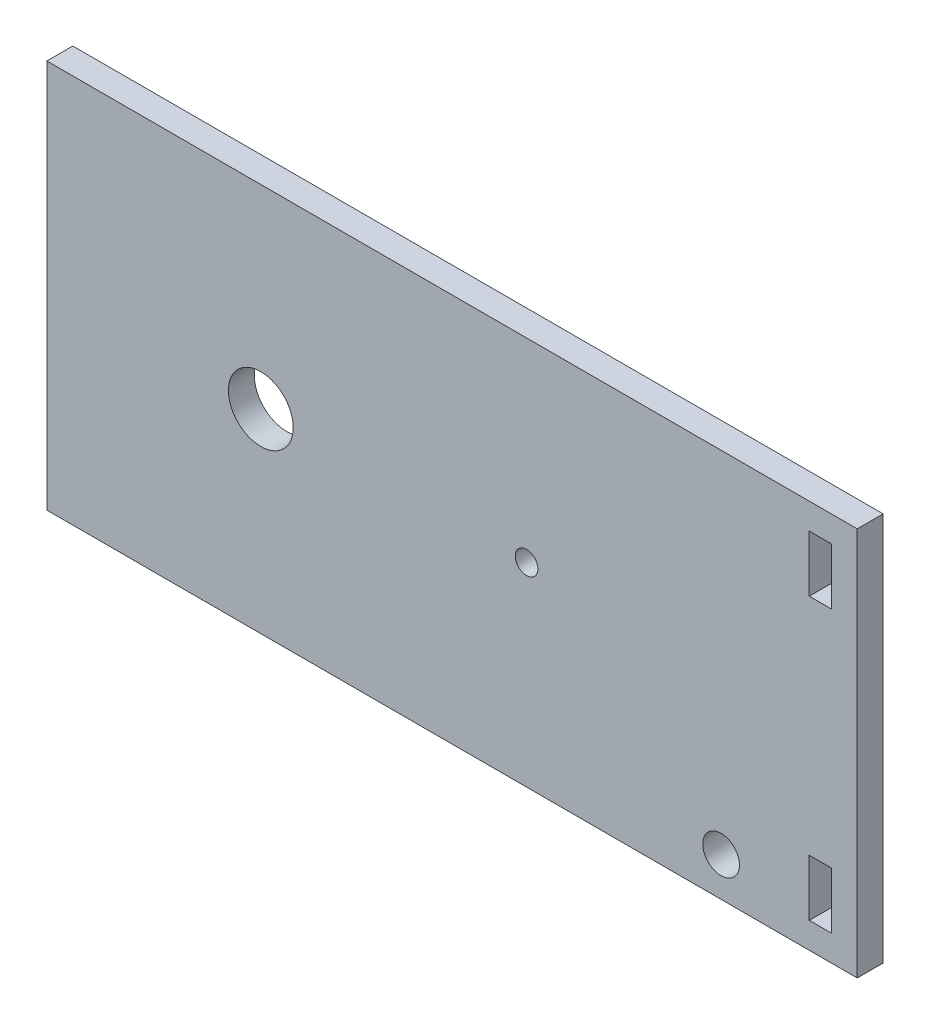
ISO-10303-21;
HEADER;
FILE_DESCRIPTION(('STEP AP214'),'2;1');
FILE_NAME('part.step','',(''),(''),'','','');
FILE_SCHEMA(('AUTOMOTIVE_DESIGN { 1 0 10303 214 1 1 1 1 }'));
ENDSEC;
DATA;
#1=APPLICATION_CONTEXT('core data for automotive mechanical design processes');
#2=APPLICATION_PROTOCOL_DEFINITION('international standard','automotive_design',2000,#1);
#3=PRODUCT_CONTEXT('',#1,'mechanical');
#4=PRODUCT('Part','Part','',(#3));
#5=PRODUCT_RELATED_PRODUCT_CATEGORY('part','',(#4));
#6=PRODUCT_DEFINITION_FORMATION('','',#4);
#7=PRODUCT_DEFINITION_CONTEXT('part definition',#1,'design');
#8=PRODUCT_DEFINITION('design','',#6,#7);
#9=PRODUCT_DEFINITION_SHAPE('','',#8);
#10=(LENGTH_UNIT() NAMED_UNIT(*) SI_UNIT(.MILLI.,.METRE.));
#11=(NAMED_UNIT(*) PLANE_ANGLE_UNIT() SI_UNIT($,.RADIAN.));
#12=(NAMED_UNIT(*) SI_UNIT($,.STERADIAN.) SOLID_ANGLE_UNIT());
#13=UNCERTAINTY_MEASURE_WITH_UNIT(LENGTH_MEASURE(1.E-05),#10,'distance_accuracy_value','');
#14=(GEOMETRIC_REPRESENTATION_CONTEXT(3) GLOBAL_UNCERTAINTY_ASSIGNED_CONTEXT((#13)) GLOBAL_UNIT_ASSIGNED_CONTEXT((#10,
#11,#12)) REPRESENTATION_CONTEXT('',''));
#15=CARTESIAN_POINT('',(0.,0.,0.));
#16=DIRECTION('',(0.,0.,1.));
#17=DIRECTION('',(1.,0.,0.));
#18=AXIS2_PLACEMENT_3D('',#15,#16,#17);
#19=CARTESIAN_POINT('',(0.,0.,4.));
#20=DIRECTION('',(0.,0.,1.));
#21=DIRECTION('',(1.,0.,0.));
#22=AXIS2_PLACEMENT_3D('',#19,#20,#21);
#23=PLANE('',#22);
#24=DIRECTION('',(-1.,0.,0.));
#25=VECTOR('',#24,1.);
#26=CARTESIAN_POINT('',(40.,26.,4.));
#27=LINE('',#26,#25);
#28=CARTESIAN_POINT('',(40.,26.,4.));
#29=VERTEX_POINT('',#28);
#30=CARTESIAN_POINT('',(36.6,26.,4.));
#31=VERTEX_POINT('',#30);
#32=EDGE_CURVE('E133',#29,#31,#27,.T.);
#33=ORIENTED_EDGE('',*,*,#32,.F.);
#34=DIRECTION('',(0.,1.,0.));
#35=VECTOR('',#34,1.);
#36=CARTESIAN_POINT('',(40.,26.,4.));
#37=LINE('',#36,#35);
#38=CARTESIAN_POINT('',(40.,17.3,4.));
#39=VERTEX_POINT('',#38);
#40=EDGE_CURVE('E124',#39,#29,#37,.T.);
#41=ORIENTED_EDGE('',*,*,#40,.F.);
#42=DIRECTION('',(1.,0.,0.));
#43=VECTOR('',#42,1.);
#44=CARTESIAN_POINT('',(40.,17.3,4.));
#45=LINE('',#44,#43);
#46=CARTESIAN_POINT('',(36.6,17.3,4.));
#47=VERTEX_POINT('',#46);
#48=EDGE_CURVE('E148',#47,#39,#45,.T.);
#49=ORIENTED_EDGE('',*,*,#48,.F.);
#50=DIRECTION('',(0.,-1.,0.));
#51=VECTOR('',#50,1.);
#52=CARTESIAN_POINT('',(36.6,26.,4.));
#53=LINE('',#52,#51);
#54=EDGE_CURVE('E146',#31,#47,#53,.T.);
#55=ORIENTED_EDGE('',*,*,#54,.F.);
#56=EDGE_LOOP('',(#33,#41,#49,#55));
#57=FACE_BOUND('',#56,.T.);
#58=DIRECTION('',(-1.,0.,0.));
#59=VECTOR('',#58,1.);
#60=CARTESIAN_POINT('',(40.,-17.3,4.));
#61=LINE('',#60,#59);
#62=CARTESIAN_POINT('',(40.,-17.3,4.));
#63=VERTEX_POINT('',#62);
#64=CARTESIAN_POINT('',(36.6,-17.3,4.));
#65=VERTEX_POINT('',#64);
#66=EDGE_CURVE('E158',#63,#65,#61,.T.);
#67=ORIENTED_EDGE('',*,*,#66,.F.);
#68=DIRECTION('',(0.,1.,0.));
#69=VECTOR('',#68,1.);
#70=CARTESIAN_POINT('',(40.,-17.3,4.));
#71=LINE('',#70,#69);
#72=CARTESIAN_POINT('',(40.,-26.,4.));
#73=VERTEX_POINT('',#72);
#74=EDGE_CURVE('E156',#73,#63,#71,.T.);
#75=ORIENTED_EDGE('',*,*,#74,.F.);
#76=DIRECTION('',(1.,0.,0.));
#77=VECTOR('',#76,1.);
#78=CARTESIAN_POINT('',(40.,-26.,4.));
#79=LINE('',#78,#77);
#80=CARTESIAN_POINT('',(36.6,-26.,4.));
#81=VERTEX_POINT('',#80);
#82=EDGE_CURVE('E162',#81,#73,#79,.T.);
#83=ORIENTED_EDGE('',*,*,#82,.F.);
#84=DIRECTION('',(0.,-1.,0.));
#85=VECTOR('',#84,1.);
#86=CARTESIAN_POINT('',(36.6,-17.3,4.));
#87=LINE('',#86,#85);
#88=EDGE_CURVE('E160',#65,#81,#87,.T.);
#89=ORIENTED_EDGE('',*,*,#88,.F.);
#90=EDGE_LOOP('',(#67,#75,#83,#89));
#91=FACE_BOUND('',#90,.T.);
#92=CARTESIAN_POINT('',(-48.,0.,4.));
#93=DIRECTION('',(0.,0.,1.));
#94=DIRECTION('',(1.,0.,0.));
#95=AXIS2_PLACEMENT_3D('',#92,#93,#94);
#96=CIRCLE('',#95,5.);
#97=CARTESIAN_POINT('',(-43.,0.,4.));
#98=VERTEX_POINT('',#97);
#99=EDGE_CURVE('E185',#98,#98,#96,.T.);
#100=ORIENTED_EDGE('',*,*,#99,.F.);
#101=EDGE_LOOP('',(#100));
#102=FACE_BOUND('',#101,.T.);
#103=DIRECTION('',(1.,0.,0.));
#104=VECTOR('',#103,1.);
#105=CARTESIAN_POINT('',(-81.,-30.,4.));
#106=LINE('',#105,#104);
#107=CARTESIAN_POINT('',(-81.,-30.,4.));
#108=VERTEX_POINT('',#107);
#109=CARTESIAN_POINT('',(44.,-30.,4.));
#110=VERTEX_POINT('',#109);
#111=EDGE_CURVE('E202',#108,#110,#106,.T.);
#112=ORIENTED_EDGE('',*,*,#111,.T.);
#113=DIRECTION('',(0.,1.,0.));
#114=VECTOR('',#113,1.);
#115=CARTESIAN_POINT('',(44.,-30.,4.));
#116=LINE('',#115,#114);
#117=CARTESIAN_POINT('',(44.,30.,4.));
#118=VERTEX_POINT('',#117);
#119=EDGE_CURVE('E172',#110,#118,#116,.T.);
#120=ORIENTED_EDGE('',*,*,#119,.T.);
#121=DIRECTION('',(-1.,0.,0.));
#122=VECTOR('',#121,1.);
#123=CARTESIAN_POINT('',(-81.,30.,4.));
#124=LINE('',#123,#122);
#125=CARTESIAN_POINT('',(-81.,30.,4.));
#126=VERTEX_POINT('',#125);
#127=EDGE_CURVE('E197',#118,#126,#124,.T.);
#128=ORIENTED_EDGE('',*,*,#127,.T.);
#129=DIRECTION('',(0.,-1.,0.));
#130=VECTOR('',#129,1.);
#131=CARTESIAN_POINT('',(-81.,-30.,4.));
#132=LINE('',#131,#130);
#133=EDGE_CURVE('E199',#126,#108,#132,.T.);
#134=ORIENTED_EDGE('',*,*,#133,.T.);
#135=EDGE_LOOP('',(#112,#120,#128,#134));
#136=FACE_BOUND('',#135,.T.);
#137=CARTESIAN_POINT('',(23.,-24.,4.));
#138=DIRECTION('',(0.,0.,1.));
#139=DIRECTION('',(1.,0.,0.));
#140=AXIS2_PLACEMENT_3D('',#137,#138,#139);
#141=CIRCLE('',#140,2.83);
#142=CARTESIAN_POINT('',(25.83,-24.,4.));
#143=VERTEX_POINT('',#142);
#144=EDGE_CURVE('E191',#143,#143,#141,.T.);
#145=ORIENTED_EDGE('',*,*,#144,.F.);
#146=EDGE_LOOP('',(#145));
#147=FACE_BOUND('',#146,.T.);
#148=CARTESIAN_POINT('',(-6.99999999999999,0.,4.));
#149=DIRECTION('',(0.,0.,1.));
#150=DIRECTION('',(1.,0.,0.));
#151=AXIS2_PLACEMENT_3D('',#148,#149,#150);
#152=CIRCLE('',#151,1.75);
#153=CARTESIAN_POINT('',(-5.24999999999999,0.,4.));
#154=VERTEX_POINT('',#153);
#155=EDGE_CURVE('E141',#154,#154,#152,.T.);
#156=ORIENTED_EDGE('',*,*,#155,.F.);
#157=EDGE_LOOP('',(#156));
#158=FACE_BOUND('',#157,.T.);
#159=ADVANCED_FACE('F33',(#57,#91,#102,#136,#147,#158),#23,.T.);
#160=CARTESIAN_POINT('',(0.,0.,0.));
#161=DIRECTION('',(0.,0.,1.));
#162=DIRECTION('',(1.,0.,0.));
#163=AXIS2_PLACEMENT_3D('',#160,#161,#162);
#164=PLANE('',#163);
#165=DIRECTION('',(0.,-1.,0.));
#166=VECTOR('',#165,1.);
#167=CARTESIAN_POINT('',(40.,0.,0.));
#168=LINE('',#167,#166);
#169=CARTESIAN_POINT('',(40.,-17.3,0.));
#170=VERTEX_POINT('',#169);
#171=CARTESIAN_POINT('',(40.,-26.,0.));
#172=VERTEX_POINT('',#171);
#173=EDGE_CURVE('E220',#170,#172,#168,.T.);
#174=ORIENTED_EDGE('',*,*,#173,.F.);
#175=DIRECTION('',(1.,0.,0.));
#176=VECTOR('',#175,1.);
#177=CARTESIAN_POINT('',(0.,-17.3,0.));
#178=LINE('',#177,#176);
#179=CARTESIAN_POINT('',(36.6,-17.3,0.));
#180=VERTEX_POINT('',#179);
#181=EDGE_CURVE('E218',#180,#170,#178,.T.);
#182=ORIENTED_EDGE('',*,*,#181,.F.);
#183=DIRECTION('',(0.,1.,0.));
#184=VECTOR('',#183,1.);
#185=CARTESIAN_POINT('',(36.6,0.,0.));
#186=LINE('',#185,#184);
#187=CARTESIAN_POINT('',(36.6,-26.,0.));
#188=VERTEX_POINT('',#187);
#189=EDGE_CURVE('E216',#188,#180,#186,.T.);
#190=ORIENTED_EDGE('',*,*,#189,.F.);
#191=DIRECTION('',(-1.,0.,0.));
#192=VECTOR('',#191,1.);
#193=CARTESIAN_POINT('',(0.,-26.,0.));
#194=LINE('',#193,#192);
#195=EDGE_CURVE('E214',#172,#188,#194,.T.);
#196=ORIENTED_EDGE('',*,*,#195,.F.);
#197=EDGE_LOOP('',(#174,#182,#190,#196));
#198=FACE_BOUND('',#197,.T.);
#199=DIRECTION('',(-1.,0.,0.));
#200=VECTOR('',#199,1.);
#201=CARTESIAN_POINT('',(-81.,30.,0.));
#202=LINE('',#201,#200);
#203=CARTESIAN_POINT('',(44.,30.,0.));
#204=VERTEX_POINT('',#203);
#205=CARTESIAN_POINT('',(-81.,30.,0.));
#206=VERTEX_POINT('',#205);
#207=EDGE_CURVE('E194',#204,#206,#202,.T.);
#208=ORIENTED_EDGE('',*,*,#207,.F.);
#209=DIRECTION('',(0.,1.,0.));
#210=VECTOR('',#209,1.);
#211=CARTESIAN_POINT('',(44.,-30.,0.));
#212=LINE('',#211,#210);
#213=CARTESIAN_POINT('',(44.,-30.,0.));
#214=VERTEX_POINT('',#213);
#215=EDGE_CURVE('E176',#214,#204,#212,.T.);
#216=ORIENTED_EDGE('',*,*,#215,.F.);
#217=DIRECTION('',(1.,0.,0.));
#218=VECTOR('',#217,1.);
#219=CARTESIAN_POINT('',(-81.,-30.,0.));
#220=LINE('',#219,#218);
#221=CARTESIAN_POINT('',(-81.,-30.,0.));
#222=VERTEX_POINT('',#221);
#223=EDGE_CURVE('E200',#222,#214,#220,.T.);
#224=ORIENTED_EDGE('',*,*,#223,.F.);
#225=DIRECTION('',(0.,-1.,0.));
#226=VECTOR('',#225,1.);
#227=CARTESIAN_POINT('',(-81.,-30.,0.));
#228=LINE('',#227,#226);
#229=EDGE_CURVE('E206',#206,#222,#228,.T.);
#230=ORIENTED_EDGE('',*,*,#229,.F.);
#231=EDGE_LOOP('',(#208,#216,#224,#230));
#232=FACE_BOUND('',#231,.T.);
#233=CARTESIAN_POINT('',(23.,-24.,0.));
#234=DIRECTION('',(0.,0.,1.));
#235=DIRECTION('',(1.,0.,0.));
#236=AXIS2_PLACEMENT_3D('',#233,#234,#235);
#237=CIRCLE('',#236,2.83);
#238=CARTESIAN_POINT('',(25.83,-24.,0.));
#239=VERTEX_POINT('',#238);
#240=EDGE_CURVE('E188',#239,#239,#237,.T.);
#241=ORIENTED_EDGE('',*,*,#240,.T.);
#242=EDGE_LOOP('',(#241));
#243=FACE_BOUND('',#242,.T.);
#244=CARTESIAN_POINT('',(-48.,0.,0.));
#245=DIRECTION('',(0.,0.,1.));
#246=DIRECTION('',(1.,0.,0.));
#247=AXIS2_PLACEMENT_3D('',#244,#245,#246);
#248=CIRCLE('',#247,5.);
#249=CARTESIAN_POINT('',(-43.,0.,0.));
#250=VERTEX_POINT('',#249);
#251=EDGE_CURVE('E184',#250,#250,#248,.T.);
#252=ORIENTED_EDGE('',*,*,#251,.T.);
#253=EDGE_LOOP('',(#252));
#254=FACE_BOUND('',#253,.T.);
#255=DIRECTION('',(0.,-1.,0.));
#256=VECTOR('',#255,1.);
#257=CARTESIAN_POINT('',(40.,0.,0.));
#258=LINE('',#257,#256);
#259=CARTESIAN_POINT('',(40.,26.,0.));
#260=VERTEX_POINT('',#259);
#261=CARTESIAN_POINT('',(40.,17.3,0.));
#262=VERTEX_POINT('',#261);
#263=EDGE_CURVE('E11',#260,#262,#258,.T.);
#264=ORIENTED_EDGE('',*,*,#263,.F.);
#265=DIRECTION('',(1.,0.,0.));
#266=VECTOR('',#265,1.);
#267=CARTESIAN_POINT('',(0.,26.,0.));
#268=LINE('',#267,#266);
#269=CARTESIAN_POINT('',(36.6,26.,0.));
#270=VERTEX_POINT('',#269);
#271=EDGE_CURVE('E42',#270,#260,#268,.T.);
#272=ORIENTED_EDGE('',*,*,#271,.F.);
#273=DIRECTION('',(0.,1.,0.));
#274=VECTOR('',#273,1.);
#275=CARTESIAN_POINT('',(36.6,0.,0.));
#276=LINE('',#275,#274);
#277=CARTESIAN_POINT('',(36.6,17.3,0.));
#278=VERTEX_POINT('',#277);
#279=EDGE_CURVE('E225',#278,#270,#276,.T.);
#280=ORIENTED_EDGE('',*,*,#279,.F.);
#281=DIRECTION('',(-1.,0.,0.));
#282=VECTOR('',#281,1.);
#283=CARTESIAN_POINT('',(0.,17.3,0.));
#284=LINE('',#283,#282);
#285=EDGE_CURVE('E223',#262,#278,#284,.T.);
#286=ORIENTED_EDGE('',*,*,#285,.F.);
#287=EDGE_LOOP('',(#264,#272,#280,#286));
#288=FACE_BOUND('',#287,.T.);
#289=CARTESIAN_POINT('',(-6.99999999999999,0.,0.));
#290=DIRECTION('',(0.,0.,1.));
#291=DIRECTION('',(1.,0.,0.));
#292=AXIS2_PLACEMENT_3D('',#289,#290,#291);
#293=CIRCLE('',#292,1.75);
#294=CARTESIAN_POINT('',(-5.24999999999999,0.,0.));
#295=VERTEX_POINT('',#294);
#296=EDGE_CURVE('E37',#295,#295,#293,.F.);
#297=ORIENTED_EDGE('',*,*,#296,.F.);
#298=EDGE_LOOP('',(#297));
#299=FACE_BOUND('',#298,.T.);
#300=ADVANCED_FACE('F232',(#198,#232,#243,#254,#288,#299),#164,.F.);
#301=CARTESIAN_POINT('',(-81.,30.,4.));
#302=DIRECTION('',(0.,-1.,0.));
#303=DIRECTION('',(0.,0.,-1.));
#304=AXIS2_PLACEMENT_3D('',#301,#302,#303);
#305=PLANE('',#304);
#306=ORIENTED_EDGE('',*,*,#207,.T.);
#307=DIRECTION('',(0.,0.,-1.));
#308=VECTOR('',#307,1.);
#309=CARTESIAN_POINT('',(-81.,30.,4.));
#310=LINE('',#309,#308);
#311=EDGE_CURVE('E211',#126,#206,#310,.T.);
#312=ORIENTED_EDGE('',*,*,#311,.F.);
#313=ORIENTED_EDGE('',*,*,#127,.F.);
#314=DIRECTION('',(0.,0.,-1.));
#315=VECTOR('',#314,1.);
#316=CARTESIAN_POINT('',(44.,30.,4.));
#317=LINE('',#316,#315);
#318=EDGE_CURVE('E175',#118,#204,#317,.T.);
#319=ORIENTED_EDGE('',*,*,#318,.T.);
#320=EDGE_LOOP('',(#306,#312,#313,#319));
#321=FACE_BOUND('',#320,.T.);
#322=ADVANCED_FACE('F35',(#321),#305,.F.);
#323=CARTESIAN_POINT('',(-81.,-30.,4.));
#324=DIRECTION('',(1.,0.,0.));
#325=DIRECTION('',(0.,0.,-1.));
#326=AXIS2_PLACEMENT_3D('',#323,#324,#325);
#327=PLANE('',#326);
#328=ORIENTED_EDGE('',*,*,#229,.T.);
#329=DIRECTION('',(0.,0.,-1.));
#330=VECTOR('',#329,1.);
#331=CARTESIAN_POINT('',(-81.,-30.,4.));
#332=LINE('',#331,#330);
#333=EDGE_CURVE('E204',#108,#222,#332,.T.);
#334=ORIENTED_EDGE('',*,*,#333,.F.);
#335=ORIENTED_EDGE('',*,*,#133,.F.);
#336=ORIENTED_EDGE('',*,*,#311,.T.);
#337=EDGE_LOOP('',(#328,#334,#335,#336));
#338=FACE_BOUND('',#337,.T.);
#339=ADVANCED_FACE('F258',(#338),#327,.F.);
#340=CARTESIAN_POINT('',(-81.,-30.,4.));
#341=DIRECTION('',(0.,1.,0.));
#342=DIRECTION('',(0.,0.,1.));
#343=AXIS2_PLACEMENT_3D('',#340,#341,#342);
#344=PLANE('',#343);
#345=ORIENTED_EDGE('',*,*,#223,.T.);
#346=DIRECTION('',(0.,0.,-1.));
#347=VECTOR('',#346,1.);
#348=CARTESIAN_POINT('',(44.,-30.,4.));
#349=LINE('',#348,#347);
#350=EDGE_CURVE('E181',#110,#214,#349,.T.);
#351=ORIENTED_EDGE('',*,*,#350,.F.);
#352=ORIENTED_EDGE('',*,*,#111,.F.);
#353=ORIENTED_EDGE('',*,*,#333,.T.);
#354=EDGE_LOOP('',(#345,#351,#352,#353));
#355=FACE_BOUND('',#354,.T.);
#356=ADVANCED_FACE('F256',(#355),#344,.F.);
#357=CARTESIAN_POINT('',(23.,-24.,4.));
#358=DIRECTION('',(0.,0.,-1.));
#359=DIRECTION('',(-1.,0.,0.));
#360=AXIS2_PLACEMENT_3D('',#357,#358,#359);
#361=CYLINDRICAL_SURFACE('',#360,2.83);
#362=ORIENTED_EDGE('',*,*,#144,.T.);
#363=EDGE_LOOP('',(#362));
#364=FACE_BOUND('',#363,.T.);
#365=ORIENTED_EDGE('',*,*,#240,.F.);
#366=EDGE_LOOP('',(#365));
#367=FACE_BOUND('',#366,.T.);
#368=ADVANCED_FACE('F253',(#364,#367),#361,.F.);
#369=CARTESIAN_POINT('',(-48.,0.,4.));
#370=DIRECTION('',(0.,0.,-1.));
#371=DIRECTION('',(-1.,0.,0.));
#372=AXIS2_PLACEMENT_3D('',#369,#370,#371);
#373=CYLINDRICAL_SURFACE('',#372,5.);
#374=ORIENTED_EDGE('',*,*,#99,.T.);
#375=EDGE_LOOP('',(#374));
#376=FACE_BOUND('',#375,.T.);
#377=ORIENTED_EDGE('',*,*,#251,.F.);
#378=EDGE_LOOP('',(#377));
#379=FACE_BOUND('',#378,.T.);
#380=ADVANCED_FACE('F292',(#376,#379),#373,.F.);
#381=CARTESIAN_POINT('',(44.,-30.,4.));
#382=DIRECTION('',(-1.,0.,0.));
#383=DIRECTION('',(0.,0.,1.));
#384=AXIS2_PLACEMENT_3D('',#381,#382,#383);
#385=PLANE('',#384);
#386=ORIENTED_EDGE('',*,*,#215,.T.);
#387=ORIENTED_EDGE('',*,*,#318,.F.);
#388=ORIENTED_EDGE('',*,*,#119,.F.);
#389=ORIENTED_EDGE('',*,*,#350,.T.);
#390=EDGE_LOOP('',(#386,#387,#388,#389));
#391=FACE_BOUND('',#390,.T.);
#392=ADVANCED_FACE('F278',(#391),#385,.F.);
#393=CARTESIAN_POINT('',(40.,-17.3,4.));
#394=DIRECTION('',(-1.,0.,0.));
#395=DIRECTION('',(0.,0.,1.));
#396=AXIS2_PLACEMENT_3D('',#393,#394,#395);
#397=PLANE('',#396);
#398=ORIENTED_EDGE('',*,*,#173,.T.);
#399=DIRECTION('',(0.,0.,-1.));
#400=VECTOR('',#399,1.);
#401=CARTESIAN_POINT('',(40.,-26.,4.));
#402=LINE('',#401,#400);
#403=EDGE_CURVE('E164',#73,#172,#402,.T.);
#404=ORIENTED_EDGE('',*,*,#403,.F.);
#405=ORIENTED_EDGE('',*,*,#74,.T.);
#406=DIRECTION('',(0.,0.,-1.));
#407=VECTOR('',#406,1.);
#408=CARTESIAN_POINT('',(40.,-17.3,4.));
#409=LINE('',#408,#407);
#410=EDGE_CURVE('E134',#63,#170,#409,.T.);
#411=ORIENTED_EDGE('',*,*,#410,.T.);
#412=EDGE_LOOP('',(#398,#404,#405,#411));
#413=FACE_BOUND('',#412,.T.);
#414=ADVANCED_FACE('F302',(#413),#397,.T.);
#415=CARTESIAN_POINT('',(40.,-17.3,4.));
#416=DIRECTION('',(0.,-1.,0.));
#417=DIRECTION('',(1.,0.,0.));
#418=AXIS2_PLACEMENT_3D('',#415,#416,#417);
#419=PLANE('',#418);
#420=ORIENTED_EDGE('',*,*,#181,.T.);
#421=ORIENTED_EDGE('',*,*,#410,.F.);
#422=ORIENTED_EDGE('',*,*,#66,.T.);
#423=DIRECTION('',(0.,0.,-1.));
#424=VECTOR('',#423,1.);
#425=CARTESIAN_POINT('',(36.6,-17.3,4.));
#426=LINE('',#425,#424);
#427=EDGE_CURVE('E167',#65,#180,#426,.T.);
#428=ORIENTED_EDGE('',*,*,#427,.T.);
#429=EDGE_LOOP('',(#420,#421,#422,#428));
#430=FACE_BOUND('',#429,.T.);
#431=ADVANCED_FACE('F307',(#430),#419,.T.);
#432=CARTESIAN_POINT('',(36.6,-17.3,4.));
#433=DIRECTION('',(1.,0.,0.));
#434=DIRECTION('',(0.,0.,-1.));
#435=AXIS2_PLACEMENT_3D('',#432,#433,#434);
#436=PLANE('',#435);
#437=ORIENTED_EDGE('',*,*,#189,.T.);
#438=ORIENTED_EDGE('',*,*,#427,.F.);
#439=ORIENTED_EDGE('',*,*,#88,.T.);
#440=DIRECTION('',(0.,0.,-1.));
#441=VECTOR('',#440,1.);
#442=CARTESIAN_POINT('',(36.6,-26.,4.));
#443=LINE('',#442,#441);
#444=EDGE_CURVE('E57',#81,#188,#443,.T.);
#445=ORIENTED_EDGE('',*,*,#444,.T.);
#446=EDGE_LOOP('',(#437,#438,#439,#445));
#447=FACE_BOUND('',#446,.T.);
#448=ADVANCED_FACE('F311',(#447),#436,.T.);
#449=CARTESIAN_POINT('',(40.,-26.,4.));
#450=DIRECTION('',(0.,1.,0.));
#451=DIRECTION('',(-1.,0.,0.));
#452=AXIS2_PLACEMENT_3D('',#449,#450,#451);
#453=PLANE('',#452);
#454=ORIENTED_EDGE('',*,*,#195,.T.);
#455=ORIENTED_EDGE('',*,*,#444,.F.);
#456=ORIENTED_EDGE('',*,*,#82,.T.);
#457=ORIENTED_EDGE('',*,*,#403,.T.);
#458=EDGE_LOOP('',(#454,#455,#456,#457));
#459=FACE_BOUND('',#458,.T.);
#460=ADVANCED_FACE('F315',(#459),#453,.T.);
#461=CARTESIAN_POINT('',(40.,26.,4.));
#462=DIRECTION('',(-1.,0.,0.));
#463=DIRECTION('',(0.,0.,1.));
#464=AXIS2_PLACEMENT_3D('',#461,#462,#463);
#465=PLANE('',#464);
#466=ORIENTED_EDGE('',*,*,#263,.T.);
#467=DIRECTION('',(0.,0.,-1.));
#468=VECTOR('',#467,1.);
#469=CARTESIAN_POINT('',(40.,17.3,4.));
#470=LINE('',#469,#468);
#471=EDGE_CURVE('E129',#39,#262,#470,.T.);
#472=ORIENTED_EDGE('',*,*,#471,.F.);
#473=ORIENTED_EDGE('',*,*,#40,.T.);
#474=DIRECTION('',(0.,0.,-1.));
#475=VECTOR('',#474,1.);
#476=CARTESIAN_POINT('',(40.,26.,4.));
#477=LINE('',#476,#475);
#478=EDGE_CURVE('E127',#29,#260,#477,.T.);
#479=ORIENTED_EDGE('',*,*,#478,.T.);
#480=EDGE_LOOP('',(#466,#472,#473,#479));
#481=FACE_BOUND('',#480,.T.);
#482=ADVANCED_FACE('F126',(#481),#465,.T.);
#483=CARTESIAN_POINT('',(40.,26.,4.));
#484=DIRECTION('',(0.,-1.,0.));
#485=DIRECTION('',(0.,0.,-1.));
#486=AXIS2_PLACEMENT_3D('',#483,#484,#485);
#487=PLANE('',#486);
#488=ORIENTED_EDGE('',*,*,#271,.T.);
#489=ORIENTED_EDGE('',*,*,#478,.F.);
#490=ORIENTED_EDGE('',*,*,#32,.T.);
#491=DIRECTION('',(0.,0.,-1.));
#492=VECTOR('',#491,1.);
#493=CARTESIAN_POINT('',(36.6,26.,4.));
#494=LINE('',#493,#492);
#495=EDGE_CURVE('E142',#31,#270,#494,.T.);
#496=ORIENTED_EDGE('',*,*,#495,.T.);
#497=EDGE_LOOP('',(#488,#489,#490,#496));
#498=FACE_BOUND('',#497,.T.);
#499=ADVANCED_FACE('F137',(#498),#487,.T.);
#500=CARTESIAN_POINT('',(36.6,26.,4.));
#501=DIRECTION('',(1.,0.,0.));
#502=DIRECTION('',(0.,0.,-1.));
#503=AXIS2_PLACEMENT_3D('',#500,#501,#502);
#504=PLANE('',#503);
#505=ORIENTED_EDGE('',*,*,#279,.T.);
#506=ORIENTED_EDGE('',*,*,#495,.F.);
#507=ORIENTED_EDGE('',*,*,#54,.T.);
#508=DIRECTION('',(0.,0.,-1.));
#509=VECTOR('',#508,1.);
#510=CARTESIAN_POINT('',(36.6,17.3,4.));
#511=LINE('',#510,#509);
#512=EDGE_CURVE('E49',#47,#278,#511,.T.);
#513=ORIENTED_EDGE('',*,*,#512,.T.);
#514=EDGE_LOOP('',(#505,#506,#507,#513));
#515=FACE_BOUND('',#514,.T.);
#516=ADVANCED_FACE('F229',(#515),#504,.T.);
#517=CARTESIAN_POINT('',(40.,17.3,4.));
#518=DIRECTION('',(0.,1.,0.));
#519=DIRECTION('',(0.,0.,1.));
#520=AXIS2_PLACEMENT_3D('',#517,#518,#519);
#521=PLANE('',#520);
#522=ORIENTED_EDGE('',*,*,#285,.T.);
#523=ORIENTED_EDGE('',*,*,#512,.F.);
#524=ORIENTED_EDGE('',*,*,#48,.T.);
#525=ORIENTED_EDGE('',*,*,#471,.T.);
#526=EDGE_LOOP('',(#522,#523,#524,#525));
#527=FACE_BOUND('',#526,.T.);
#528=ADVANCED_FACE('F234',(#527),#521,.T.);
#529=CARTESIAN_POINT('',(-6.99999999999999,0.,4.));
#530=DIRECTION('',(0.,0.,-1.));
#531=DIRECTION('',(-1.,0.,0.));
#532=AXIS2_PLACEMENT_3D('',#529,#530,#531);
#533=CYLINDRICAL_SURFACE('',#532,1.75);
#534=ORIENTED_EDGE('',*,*,#155,.T.);
#535=EDGE_LOOP('',(#534));
#536=FACE_BOUND('',#535,.T.);
#537=ORIENTED_EDGE('',*,*,#296,.T.);
#538=EDGE_LOOP('',(#537));
#539=FACE_BOUND('',#538,.T.);
#540=ADVANCED_FACE('F236',(#536,#539),#533,.F.);
#541=CLOSED_SHELL('',(#159,#300,#322,#339,#356,#368,#380,#392,#414,#431,#448,#460,#482,#499,
#516,#528,#540));
#542=MANIFOLD_SOLID_BREP('B2',#541);
#543=ADVANCED_BREP_SHAPE_REPRESENTATION('',(#18,#542),#14);
#544=SHAPE_DEFINITION_REPRESENTATION(#9,#543);
ENDSEC;
END-ISO-10303-21;
